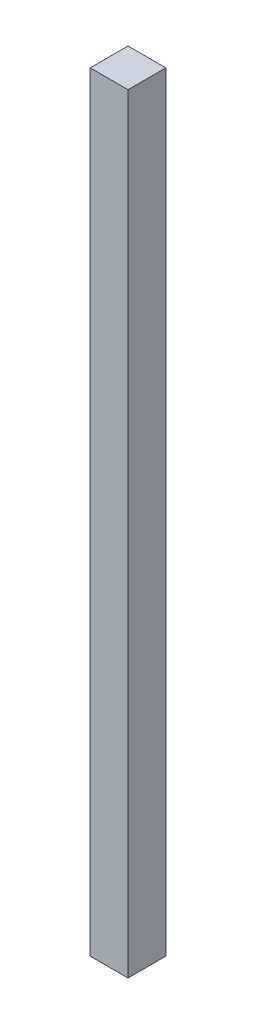
ISO-10303-21;
HEADER;
FILE_DESCRIPTION(('STEP AP214'),'2;1');
FILE_NAME('part.step','',(''),(''),'','','');
FILE_SCHEMA(('AUTOMOTIVE_DESIGN { 1 0 10303 214 1 1 1 1 }'));
ENDSEC;
DATA;
#1=APPLICATION_CONTEXT('core data for automotive mechanical design processes');
#2=APPLICATION_PROTOCOL_DEFINITION('international standard','automotive_design',2000,#1);
#3=PRODUCT_CONTEXT('',#1,'mechanical');
#4=PRODUCT('Part','Part','',(#3));
#5=PRODUCT_RELATED_PRODUCT_CATEGORY('part','',(#4));
#6=PRODUCT_DEFINITION_FORMATION('','',#4);
#7=PRODUCT_DEFINITION_CONTEXT('part definition',#1,'design');
#8=PRODUCT_DEFINITION('design','',#6,#7);
#9=PRODUCT_DEFINITION_SHAPE('','',#8);
#10=(LENGTH_UNIT() NAMED_UNIT(*) SI_UNIT(.MILLI.,.METRE.));
#11=(NAMED_UNIT(*) PLANE_ANGLE_UNIT() SI_UNIT($,.RADIAN.));
#12=(NAMED_UNIT(*) SI_UNIT($,.STERADIAN.) SOLID_ANGLE_UNIT());
#13=UNCERTAINTY_MEASURE_WITH_UNIT(LENGTH_MEASURE(1.E-05),#10,'distance_accuracy_value','');
#14=(GEOMETRIC_REPRESENTATION_CONTEXT(3) GLOBAL_UNCERTAINTY_ASSIGNED_CONTEXT((#13)) GLOBAL_UNIT_ASSIGNED_CONTEXT((#10,
#11,#12)) REPRESENTATION_CONTEXT('',''));
#15=CARTESIAN_POINT('',(0.,0.,0.));
#16=DIRECTION('',(0.,0.,1.));
#17=DIRECTION('',(1.,0.,0.));
#18=AXIS2_PLACEMENT_3D('',#15,#16,#17);
#19=CARTESIAN_POINT('',(7.5,304.8,7.5));
#20=DIRECTION('',(-1.,0.,0.));
#21=DIRECTION('',(0.,0.,1.));
#22=AXIS2_PLACEMENT_3D('',#19,#20,#21);
#23=PLANE('',#22);
#24=DIRECTION('',(0.,0.,-1.));
#25=VECTOR('',#24,1.);
#26=CARTESIAN_POINT('',(7.5,0.,7.5));
#27=LINE('',#26,#25);
#28=CARTESIAN_POINT('',(7.5,0.,7.5));
#29=VERTEX_POINT('',#28);
#30=CARTESIAN_POINT('',(7.5,0.,-7.5));
#31=VERTEX_POINT('',#30);
#32=EDGE_CURVE('E101',#29,#31,#27,.T.);
#33=ORIENTED_EDGE('',*,*,#32,.T.);
#34=DIRECTION('',(0.,-1.,0.));
#35=VECTOR('',#34,1.);
#36=CARTESIAN_POINT('',(7.5,304.8,-7.5));
#37=LINE('',#36,#35);
#38=CARTESIAN_POINT('',(7.5,304.8,-7.5));
#39=VERTEX_POINT('',#38);
#40=EDGE_CURVE('E11',#39,#31,#37,.T.);
#41=ORIENTED_EDGE('',*,*,#40,.F.);
#42=DIRECTION('',(0.,0.,-1.));
#43=VECTOR('',#42,1.);
#44=CARTESIAN_POINT('',(7.5,304.8,7.5));
#45=LINE('',#44,#43);
#46=CARTESIAN_POINT('',(7.5,304.8,7.5));
#47=VERTEX_POINT('',#46);
#48=EDGE_CURVE('E89',#47,#39,#45,.T.);
#49=ORIENTED_EDGE('',*,*,#48,.F.);
#50=DIRECTION('',(0.,-1.,0.));
#51=VECTOR('',#50,1.);
#52=CARTESIAN_POINT('',(7.5,304.8,7.5));
#53=LINE('',#52,#51);
#54=EDGE_CURVE('E97',#47,#29,#53,.T.);
#55=ORIENTED_EDGE('',*,*,#54,.T.);
#56=EDGE_LOOP('',(#33,#41,#49,#55));
#57=FACE_BOUND('',#56,.T.);
#58=ADVANCED_FACE('F38',(#57),#23,.F.);
#59=CARTESIAN_POINT('',(-7.5,304.8,-7.5));
#60=DIRECTION('',(0.,0.,1.));
#61=DIRECTION('',(1.,0.,0.));
#62=AXIS2_PLACEMENT_3D('',#59,#60,#61);
#63=PLANE('',#62);
#64=DIRECTION('',(-1.,0.,0.));
#65=VECTOR('',#64,1.);
#66=CARTESIAN_POINT('',(-7.5,0.,-7.5));
#67=LINE('',#66,#65);
#68=CARTESIAN_POINT('',(-7.5,0.,-7.5));
#69=VERTEX_POINT('',#68);
#70=EDGE_CURVE('E93',#31,#69,#67,.T.);
#71=ORIENTED_EDGE('',*,*,#70,.T.);
#72=DIRECTION('',(0.,-1.,0.));
#73=VECTOR('',#72,1.);
#74=CARTESIAN_POINT('',(-7.5,304.8,-7.5));
#75=LINE('',#74,#73);
#76=CARTESIAN_POINT('',(-7.5,304.8,-7.5));
#77=VERTEX_POINT('',#76);
#78=EDGE_CURVE('E46',#77,#69,#75,.T.);
#79=ORIENTED_EDGE('',*,*,#78,.F.);
#80=DIRECTION('',(-1.,0.,0.));
#81=VECTOR('',#80,1.);
#82=CARTESIAN_POINT('',(-7.5,304.8,-7.5));
#83=LINE('',#82,#81);
#84=EDGE_CURVE('E84',#39,#77,#83,.T.);
#85=ORIENTED_EDGE('',*,*,#84,.F.);
#86=ORIENTED_EDGE('',*,*,#40,.T.);
#87=EDGE_LOOP('',(#71,#79,#85,#86));
#88=FACE_BOUND('',#87,.T.);
#89=ADVANCED_FACE('F92',(#88),#63,.F.);
#90=CARTESIAN_POINT('',(-7.5,304.8,7.5));
#91=DIRECTION('',(1.,0.,0.));
#92=DIRECTION('',(0.,0.,-1.));
#93=AXIS2_PLACEMENT_3D('',#90,#91,#92);
#94=PLANE('',#93);
#95=DIRECTION('',(0.,0.,1.));
#96=VECTOR('',#95,1.);
#97=CARTESIAN_POINT('',(-7.5,0.,7.5));
#98=LINE('',#97,#96);
#99=CARTESIAN_POINT('',(-7.5,0.,7.5));
#100=VERTEX_POINT('',#99);
#101=EDGE_CURVE('E71',#69,#100,#98,.T.);
#102=ORIENTED_EDGE('',*,*,#101,.T.);
#103=DIRECTION('',(0.,-1.,0.));
#104=VECTOR('',#103,1.);
#105=CARTESIAN_POINT('',(-7.5,304.8,7.5));
#106=LINE('',#105,#104);
#107=CARTESIAN_POINT('',(-7.5,304.8,7.5));
#108=VERTEX_POINT('',#107);
#109=EDGE_CURVE('E94',#108,#100,#106,.T.);
#110=ORIENTED_EDGE('',*,*,#109,.F.);
#111=DIRECTION('',(0.,0.,1.));
#112=VECTOR('',#111,1.);
#113=CARTESIAN_POINT('',(-7.5,304.8,7.5));
#114=LINE('',#113,#112);
#115=EDGE_CURVE('E87',#77,#108,#114,.T.);
#116=ORIENTED_EDGE('',*,*,#115,.F.);
#117=ORIENTED_EDGE('',*,*,#78,.T.);
#118=EDGE_LOOP('',(#102,#110,#116,#117));
#119=FACE_BOUND('',#118,.T.);
#120=ADVANCED_FACE('F95',(#119),#94,.F.);
#121=CARTESIAN_POINT('',(-7.5,304.8,7.5));
#122=DIRECTION('',(0.,0.,-1.));
#123=DIRECTION('',(-1.,0.,0.));
#124=AXIS2_PLACEMENT_3D('',#121,#122,#123);
#125=PLANE('',#124);
#126=DIRECTION('',(1.,0.,0.));
#127=VECTOR('',#126,1.);
#128=CARTESIAN_POINT('',(-7.5,0.,7.5));
#129=LINE('',#128,#127);
#130=EDGE_CURVE('E77',#100,#29,#129,.T.);
#131=ORIENTED_EDGE('',*,*,#130,.T.);
#132=ORIENTED_EDGE('',*,*,#54,.F.);
#133=DIRECTION('',(1.,0.,0.));
#134=VECTOR('',#133,1.);
#135=CARTESIAN_POINT('',(-7.5,304.8,7.5));
#136=LINE('',#135,#134);
#137=EDGE_CURVE('E54',#108,#47,#136,.T.);
#138=ORIENTED_EDGE('',*,*,#137,.F.);
#139=ORIENTED_EDGE('',*,*,#109,.T.);
#140=EDGE_LOOP('',(#131,#132,#138,#139));
#141=FACE_BOUND('',#140,.T.);
#142=ADVANCED_FACE('F108',(#141),#125,.F.);
#143=CARTESIAN_POINT('',(0.,304.8,0.));
#144=DIRECTION('',(0.,-1.,0.));
#145=DIRECTION('',(0.,0.,-1.));
#146=AXIS2_PLACEMENT_3D('',#143,#144,#145);
#147=PLANE('',#146);
#148=ORIENTED_EDGE('',*,*,#48,.T.);
#149=ORIENTED_EDGE('',*,*,#84,.T.);
#150=ORIENTED_EDGE('',*,*,#115,.T.);
#151=ORIENTED_EDGE('',*,*,#137,.T.);
#152=EDGE_LOOP('',(#148,#149,#150,#151));
#153=FACE_BOUND('',#152,.T.);
#154=ADVANCED_FACE('F85',(#153),#147,.F.);
#155=CARTESIAN_POINT('',(0.,0.,0.));
#156=DIRECTION('',(0.,-1.,0.));
#157=DIRECTION('',(0.,0.,-1.));
#158=AXIS2_PLACEMENT_3D('',#155,#156,#157);
#159=PLANE('',#158);
#160=ORIENTED_EDGE('',*,*,#32,.F.);
#161=ORIENTED_EDGE('',*,*,#130,.F.);
#162=ORIENTED_EDGE('',*,*,#101,.F.);
#163=ORIENTED_EDGE('',*,*,#70,.F.);
#164=EDGE_LOOP('',(#160,#161,#162,#163));
#165=FACE_BOUND('',#164,.T.);
#166=ADVANCED_FACE('F111',(#165),#159,.T.);
#167=CLOSED_SHELL('',(#58,#89,#120,#142,#154,#166));
#168=MANIFOLD_SOLID_BREP('B2',#167);
#169=ADVANCED_BREP_SHAPE_REPRESENTATION('',(#18,#168),#14);
#170=SHAPE_DEFINITION_REPRESENTATION(#9,#169);
ENDSEC;
END-ISO-10303-21;
